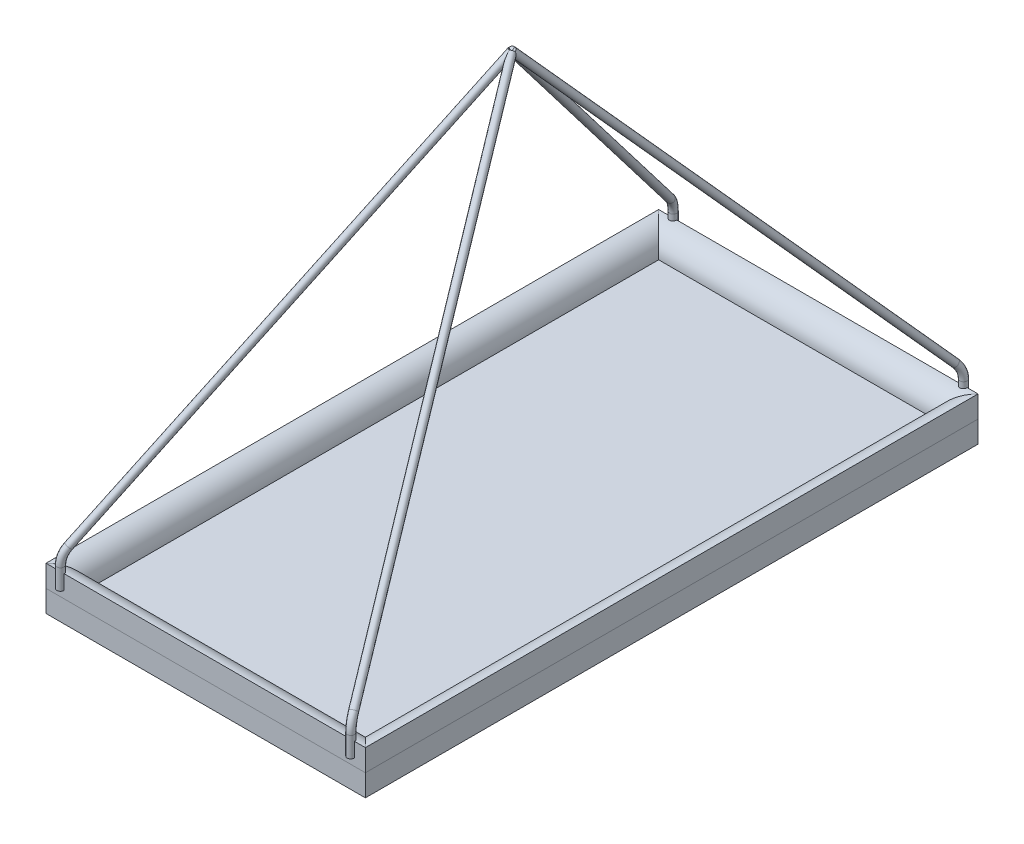
ISO-10303-21;
HEADER;
FILE_DESCRIPTION(('STEP AP214'),'2;1');
FILE_NAME('part.step','',(''),(''),'','','');
FILE_SCHEMA(('AUTOMOTIVE_DESIGN { 1 0 10303 214 1 1 1 1 }'));
ENDSEC;
DATA;
#1=APPLICATION_CONTEXT('core data for automotive mechanical design processes');
#2=APPLICATION_PROTOCOL_DEFINITION('international standard','automotive_design',2000,#1);
#3=PRODUCT_CONTEXT('',#1,'mechanical');
#4=PRODUCT('Part','Part','',(#3));
#5=PRODUCT_RELATED_PRODUCT_CATEGORY('part','',(#4));
#6=PRODUCT_DEFINITION_FORMATION('','',#4);
#7=PRODUCT_DEFINITION_CONTEXT('part definition',#1,'design');
#8=PRODUCT_DEFINITION('design','',#6,#7);
#9=PRODUCT_DEFINITION_SHAPE('','',#8);
#10=(LENGTH_UNIT() NAMED_UNIT(*) SI_UNIT(.MILLI.,.METRE.));
#11=(NAMED_UNIT(*) PLANE_ANGLE_UNIT() SI_UNIT($,.RADIAN.));
#12=(NAMED_UNIT(*) SI_UNIT($,.STERADIAN.) SOLID_ANGLE_UNIT());
#13=UNCERTAINTY_MEASURE_WITH_UNIT(LENGTH_MEASURE(1.E-05),#10,'distance_accuracy_value','');
#14=(GEOMETRIC_REPRESENTATION_CONTEXT(3) GLOBAL_UNCERTAINTY_ASSIGNED_CONTEXT((#13)) GLOBAL_UNIT_ASSIGNED_CONTEXT((#10,
#11,#12)) REPRESENTATION_CONTEXT('',''));
#15=CARTESIAN_POINT('',(0.,0.,0.));
#16=DIRECTION('',(0.,0.,1.));
#17=DIRECTION('',(1.,0.,0.));
#18=AXIS2_PLACEMENT_3D('',#15,#16,#17);
#19=CARTESIAN_POINT('',(110.,-0.01,211.01));
#20=DIRECTION('',(1.,0.,0.));
#21=DIRECTION('',(0.,0.,-1.));
#22=AXIS2_PLACEMENT_3D('',#19,#20,#21);
#23=PLANE('',#22);
#24=DIRECTION('',(0.,0.,-1.));
#25=VECTOR('',#24,1.);
#26=CARTESIAN_POINT('',(110.,15.,0.));
#27=LINE('',#26,#25);
#28=CARTESIAN_POINT('',(110.,15.,211.));
#29=VERTEX_POINT('',#28);
#30=CARTESIAN_POINT('',(110.,15.,-211.));
#31=VERTEX_POINT('',#30);
#32=EDGE_CURVE('P0_E69',#29,#31,#27,.T.);
#33=ORIENTED_EDGE('',*,*,#32,.F.);
#34=DIRECTION('',(0.,1.,0.));
#35=VECTOR('',#34,1.);
#36=CARTESIAN_POINT('',(110.,7.5,211.));
#37=LINE('',#36,#35);
#38=CARTESIAN_POINT('',(110.,0.,211.));
#39=VERTEX_POINT('',#38);
#40=EDGE_CURVE('P0_E56',#39,#29,#37,.T.);
#41=ORIENTED_EDGE('',*,*,#40,.F.);
#42=DIRECTION('',(0.,0.,1.));
#43=VECTOR('',#42,1.);
#44=CARTESIAN_POINT('',(110.,0.,0.));
#45=LINE('',#44,#43);
#46=CARTESIAN_POINT('',(110.,0.,-211.));
#47=VERTEX_POINT('',#46);
#48=EDGE_CURVE('P0_E21',#47,#39,#45,.T.);
#49=ORIENTED_EDGE('',*,*,#48,.F.);
#50=DIRECTION('',(0.,-1.,0.));
#51=VECTOR('',#50,1.);
#52=CARTESIAN_POINT('',(110.,7.5,-211.));
#53=LINE('',#52,#51);
#54=EDGE_CURVE('P0_E82',#31,#47,#53,.T.);
#55=ORIENTED_EDGE('',*,*,#54,.F.);
#56=EDGE_LOOP('',(#33,#41,#49,#55));
#57=FACE_BOUND('',#56,.T.);
#58=ADVANCED_FACE('P0_F17',(#57),#23,.T.);
#59=CARTESIAN_POINT('',(110.01,0.,211.01));
#60=DIRECTION('',(0.,-1.,0.));
#61=DIRECTION('',(-1.,0.,0.));
#62=AXIS2_PLACEMENT_3D('',#59,#60,#61);
#63=PLANE('',#62);
#64=DIRECTION('',(-1.,0.,0.));
#65=VECTOR('',#64,1.);
#66=CARTESIAN_POINT('',(0.,0.,-211.));
#67=LINE('',#66,#65);
#68=CARTESIAN_POINT('',(-110.,0.,-211.));
#69=VERTEX_POINT('',#68);
#70=EDGE_CURVE('P0_E65',#47,#69,#67,.T.);
#71=ORIENTED_EDGE('',*,*,#70,.F.);
#72=ORIENTED_EDGE('',*,*,#48,.T.);
#73=DIRECTION('',(1.,0.,0.));
#74=VECTOR('',#73,1.);
#75=CARTESIAN_POINT('',(0.,0.,211.));
#76=LINE('',#75,#74);
#77=CARTESIAN_POINT('',(-110.,0.,211.));
#78=VERTEX_POINT('',#77);
#79=EDGE_CURVE('P0_E62',#78,#39,#76,.T.);
#80=ORIENTED_EDGE('',*,*,#79,.F.);
#81=DIRECTION('',(0.,0.,1.));
#82=VECTOR('',#81,1.);
#83=CARTESIAN_POINT('',(-110.,0.,0.));
#84=LINE('',#83,#82);
#85=EDGE_CURVE('P0_E84',#69,#78,#84,.T.);
#86=ORIENTED_EDGE('',*,*,#85,.F.);
#87=EDGE_LOOP('',(#71,#72,#80,#86));
#88=FACE_BOUND('',#87,.T.);
#89=ADVANCED_FACE('P0_F61',(#88),#63,.T.);
#90=CARTESIAN_POINT('',(-110.01,-0.01,211.));
#91=DIRECTION('',(0.,0.,1.));
#92=DIRECTION('',(1.,0.,0.));
#93=AXIS2_PLACEMENT_3D('',#90,#91,#92);
#94=PLANE('',#93);
#95=DIRECTION('',(1.,0.,0.));
#96=VECTOR('',#95,1.);
#97=CARTESIAN_POINT('',(0.,15.,211.));
#98=LINE('',#97,#96);
#99=CARTESIAN_POINT('',(-110.,15.,211.));
#100=VERTEX_POINT('',#99);
#101=EDGE_CURVE('P0_E71',#100,#29,#98,.T.);
#102=ORIENTED_EDGE('',*,*,#101,.F.);
#103=DIRECTION('',(0.,1.,0.));
#104=VECTOR('',#103,1.);
#105=CARTESIAN_POINT('',(-110.,7.5,211.));
#106=LINE('',#105,#104);
#107=EDGE_CURVE('P0_E75',#78,#100,#106,.T.);
#108=ORIENTED_EDGE('',*,*,#107,.F.);
#109=ORIENTED_EDGE('',*,*,#79,.T.);
#110=ORIENTED_EDGE('',*,*,#40,.T.);
#111=EDGE_LOOP('',(#102,#108,#109,#110));
#112=FACE_BOUND('',#111,.T.);
#113=ADVANCED_FACE('P0_F73',(#112),#94,.T.);
#114=CARTESIAN_POINT('',(-110.01,15.,-211.01));
#115=DIRECTION('',(0.,1.,0.));
#116=DIRECTION('',(0.,0.,1.));
#117=AXIS2_PLACEMENT_3D('',#114,#115,#116);
#118=PLANE('',#117);
#119=DIRECTION('',(1.,0.,0.));
#120=VECTOR('',#119,1.);
#121=CARTESIAN_POINT('',(0.,15.,-211.));
#122=LINE('',#121,#120);
#123=CARTESIAN_POINT('',(-110.,15.,-211.));
#124=VERTEX_POINT('',#123);
#125=EDGE_CURVE('P0_E36',#124,#31,#122,.T.);
#126=ORIENTED_EDGE('',*,*,#125,.F.);
#127=DIRECTION('',(0.,0.,-1.));
#128=VECTOR('',#127,1.);
#129=CARTESIAN_POINT('',(-110.,15.,0.));
#130=LINE('',#129,#128);
#131=EDGE_CURVE('P0_E27',#100,#124,#130,.T.);
#132=ORIENTED_EDGE('',*,*,#131,.F.);
#133=ORIENTED_EDGE('',*,*,#101,.T.);
#134=ORIENTED_EDGE('',*,*,#32,.T.);
#135=EDGE_LOOP('',(#126,#132,#133,#134));
#136=FACE_BOUND('',#135,.T.);
#137=ADVANCED_FACE('P0_F89',(#136),#118,.T.);
#138=CARTESIAN_POINT('',(110.01,-0.01,-211.));
#139=DIRECTION('',(0.,0.,-1.));
#140=DIRECTION('',(-1.,0.,0.));
#141=AXIS2_PLACEMENT_3D('',#138,#139,#140);
#142=PLANE('',#141);
#143=ORIENTED_EDGE('',*,*,#125,.T.);
#144=ORIENTED_EDGE('',*,*,#54,.T.);
#145=ORIENTED_EDGE('',*,*,#70,.T.);
#146=DIRECTION('',(0.,-1.,0.));
#147=VECTOR('',#146,1.);
#148=CARTESIAN_POINT('',(-110.,7.5,-211.));
#149=LINE('',#148,#147);
#150=EDGE_CURVE('P0_E11',#124,#69,#149,.T.);
#151=ORIENTED_EDGE('',*,*,#150,.F.);
#152=EDGE_LOOP('',(#143,#144,#145,#151));
#153=FACE_BOUND('',#152,.T.);
#154=ADVANCED_FACE('P0_F91',(#153),#142,.T.);
#155=CARTESIAN_POINT('',(-110.,-0.01,-211.01));
#156=DIRECTION('',(-1.,0.,0.));
#157=DIRECTION('',(0.,0.,1.));
#158=AXIS2_PLACEMENT_3D('',#155,#156,#157);
#159=PLANE('',#158);
#160=ORIENTED_EDGE('',*,*,#131,.T.);
#161=ORIENTED_EDGE('',*,*,#150,.T.);
#162=ORIENTED_EDGE('',*,*,#85,.T.);
#163=ORIENTED_EDGE('',*,*,#107,.T.);
#164=EDGE_LOOP('',(#160,#161,#162,#163));
#165=FACE_BOUND('',#164,.T.);
#166=ADVANCED_FACE('P0_F19',(#165),#159,.T.);
#167=CLOSED_SHELL('',(#58,#89,#113,#137,#154,#166));
#168=MANIFOLD_SOLID_BREP('P0_B1',#167);
#169=CARTESIAN_POINT('',(98.74,18.7399999999999,206.));
#170=DIRECTION('',(0.,0.,1.));
#171=DIRECTION('',(1.,0.,0.));
#172=AXIS2_PLACEMENT_3D('',#169,#170,#171);
#173=PLANE('',#172);
#174=CARTESIAN_POINT('',(100.,19.9999999999999,206.));
#175=DIRECTION('',(0.,0.,-1.));
#176=DIRECTION('',(-1.,0.,0.));
#177=AXIS2_PLACEMENT_3D('',#174,#175,#176);
#178=CIRCLE('',#177,1.24999999999999);
#179=CARTESIAN_POINT('',(98.75,19.9999999999999,206.));
#180=VERTEX_POINT('',#179);
#181=EDGE_CURVE('P1_E21',#180,#180,#178,.T.);
#182=ORIENTED_EDGE('',*,*,#181,.F.);
#183=EDGE_LOOP('',(#182));
#184=FACE_BOUND('',#183,.T.);
#185=ADVANCED_FACE('P1_F17',(#184),#173,.T.);
#186=CARTESIAN_POINT('',(-101.26,18.7399999999999,206.));
#187=DIRECTION('',(0.,0.,1.));
#188=DIRECTION('',(1.,0.,0.));
#189=AXIS2_PLACEMENT_3D('',#186,#187,#188);
#190=PLANE('',#189);
#191=CARTESIAN_POINT('',(-100.,19.9999999999999,206.));
#192=DIRECTION('',(0.,0.,-1.));
#193=DIRECTION('',(-1.,0.,0.));
#194=AXIS2_PLACEMENT_3D('',#191,#192,#193);
#195=CIRCLE('',#194,1.25);
#196=CARTESIAN_POINT('',(-101.25,19.9999999999999,206.));
#197=VERTEX_POINT('',#196);
#198=EDGE_CURVE('P1_E116',#197,#197,#195,.T.);
#199=ORIENTED_EDGE('',*,*,#198,.F.);
#200=EDGE_LOOP('',(#199));
#201=FACE_BOUND('',#200,.T.);
#202=ADVANCED_FACE('P1_F128',(#201),#190,.T.);
#203=CARTESIAN_POINT('',(100.,19.9999999999999,211.));
#204=DIRECTION('',(0.,0.,-1.));
#205=DIRECTION('',(-1.,0.,0.));
#206=AXIS2_PLACEMENT_3D('',#203,#204,#205);
#207=CYLINDRICAL_SURFACE('',#206,1.24999999999999);
#208=ORIENTED_EDGE('',*,*,#181,.T.);
#209=EDGE_LOOP('',(#208));
#210=FACE_BOUND('',#209,.T.);
#211=CARTESIAN_POINT('',(100.,19.9999999999999,211.));
#212=DIRECTION('',(0.,0.,-1.));
#213=DIRECTION('',(-1.,0.,0.));
#214=AXIS2_PLACEMENT_3D('',#211,#212,#213);
#215=CIRCLE('',#214,1.24999999999999);
#216=CARTESIAN_POINT('',(98.75,19.9999999999999,211.));
#217=VERTEX_POINT('',#216);
#218=EDGE_CURVE('P1_E114',#217,#217,#215,.T.);
#219=ORIENTED_EDGE('',*,*,#218,.F.);
#220=EDGE_LOOP('',(#219));
#221=FACE_BOUND('',#220,.T.);
#222=ADVANCED_FACE('P1_F124',(#210,#221),#207,.F.);
#223=CARTESIAN_POINT('',(-100.,19.9999999999999,211.));
#224=DIRECTION('',(0.,0.,-1.));
#225=DIRECTION('',(-1.,0.,0.));
#226=AXIS2_PLACEMENT_3D('',#223,#224,#225);
#227=CYLINDRICAL_SURFACE('',#226,1.25);
#228=ORIENTED_EDGE('',*,*,#198,.T.);
#229=EDGE_LOOP('',(#228));
#230=FACE_BOUND('',#229,.T.);
#231=CARTESIAN_POINT('',(-100.,19.9999999999999,211.));
#232=DIRECTION('',(0.,0.,-1.));
#233=DIRECTION('',(-1.,0.,0.));
#234=AXIS2_PLACEMENT_3D('',#231,#232,#233);
#235=CIRCLE('',#234,1.25);
#236=CARTESIAN_POINT('',(-101.25,19.9999999999999,211.));
#237=VERTEX_POINT('',#236);
#238=EDGE_CURVE('P1_E81',#237,#237,#235,.T.);
#239=ORIENTED_EDGE('',*,*,#238,.F.);
#240=EDGE_LOOP('',(#239));
#241=FACE_BOUND('',#240,.T.);
#242=ADVANCED_FACE('P1_F302',(#230,#241),#227,.F.);
#243=CARTESIAN_POINT('',(110.,15.0000000000001,211.));
#244=DIRECTION('',(-1.,0.,0.));
#245=DIRECTION('',(0.,0.,1.));
#246=AXIS2_PLACEMENT_3D('',#243,#244,#245);
#247=CYLINDRICAL_SURFACE('',#246,14.9999999999999);
#248=CARTESIAN_POINT('',(110.,15.0000000000001,211.));
#249=DIRECTION('',(-0.707106781186547,0.,0.707106781186547));
#250=DIRECTION('',(-0.707106781186547,0.,-0.707106781186547));
#251=AXIS2_PLACEMENT_3D('',#248,#249,#250);
#252=ELLIPSE('',#251,21.2132034355963,14.9999999999999);
#253=CARTESIAN_POINT('',(95.0000000000001,15.,196.));
#254=VERTEX_POINT('',#253);
#255=CARTESIAN_POINT('',(110.,29.999999999999,211.));
#256=VERTEX_POINT('',#255);
#257=EDGE_CURVE('P1_E69',#254,#256,#252,.F.);
#258=ORIENTED_EDGE('',*,*,#257,.F.);
#259=DIRECTION('',(1.,0.,0.));
#260=VECTOR('',#259,1.);
#261=CARTESIAN_POINT('',(-95.,15.,196.));
#262=LINE('',#261,#260);
#263=CARTESIAN_POINT('',(-95.,15.,196.));
#264=VERTEX_POINT('',#263);
#265=EDGE_CURVE('P1_E73',#264,#254,#262,.T.);
#266=ORIENTED_EDGE('',*,*,#265,.F.);
#267=CARTESIAN_POINT('',(-110.,15.0000000000001,211.));
#268=DIRECTION('',(-0.707106781186547,0.,-0.707106781186547));
#269=DIRECTION('',(-0.707106781186547,0.,0.707106781186547));
#270=AXIS2_PLACEMENT_3D('',#267,#268,#269);
#271=ELLIPSE('',#270,21.2132034355963,14.9999999999999);
#272=CARTESIAN_POINT('',(-110.,30.,211.));
#273=VERTEX_POINT('',#272);
#274=EDGE_CURVE('P1_E80',#273,#264,#271,.T.);
#275=ORIENTED_EDGE('',*,*,#274,.F.);
#276=DIRECTION('',(-1.,0.,0.));
#277=VECTOR('',#276,1.);
#278=CARTESIAN_POINT('',(0.,30.,211.));
#279=LINE('',#278,#277);
#280=EDGE_CURVE('P1_E76',#256,#273,#279,.T.);
#281=ORIENTED_EDGE('',*,*,#280,.F.);
#282=EDGE_LOOP('',(#258,#266,#275,#281));
#283=FACE_BOUND('',#282,.T.);
#284=ADVANCED_FACE('P1_F71',(#283),#247,.T.);
#285=CARTESIAN_POINT('',(-110.01,30.01,211.));
#286=DIRECTION('',(0.,0.,1.));
#287=DIRECTION('',(0.,-1.,0.));
#288=AXIS2_PLACEMENT_3D('',#285,#286,#287);
#289=PLANE('',#288);
#290=ORIENTED_EDGE('',*,*,#238,.T.);
#291=EDGE_LOOP('',(#290));
#292=FACE_BOUND('',#291,.T.);
#293=ORIENTED_EDGE('',*,*,#218,.T.);
#294=EDGE_LOOP('',(#293));
#295=FACE_BOUND('',#294,.T.);
#296=DIRECTION('',(0.,-1.,0.));
#297=VECTOR('',#296,1.);
#298=CARTESIAN_POINT('',(110.,22.499999999999,211.));
#299=LINE('',#298,#297);
#300=CARTESIAN_POINT('',(110.,15.,211.));
#301=VERTEX_POINT('',#300);
#302=EDGE_CURVE('P1_E110',#256,#301,#299,.T.);
#303=ORIENTED_EDGE('',*,*,#302,.F.);
#304=ORIENTED_EDGE('',*,*,#280,.T.);
#305=DIRECTION('',(0.,1.,0.));
#306=VECTOR('',#305,1.);
#307=CARTESIAN_POINT('',(-110.,22.500000000001,211.));
#308=LINE('',#307,#306);
#309=CARTESIAN_POINT('',(-110.,15.000000000001,211.));
#310=VERTEX_POINT('',#309);
#311=EDGE_CURVE('P1_E99',#310,#273,#308,.T.);
#312=ORIENTED_EDGE('',*,*,#311,.F.);
#313=DIRECTION('',(-1.,0.,0.));
#314=VECTOR('',#313,1.);
#315=CARTESIAN_POINT('',(110.,15.,211.));
#316=LINE('',#315,#314);
#317=EDGE_CURVE('P1_E107',#301,#310,#316,.T.);
#318=ORIENTED_EDGE('',*,*,#317,.F.);
#319=EDGE_LOOP('',(#303,#304,#312,#318));
#320=FACE_BOUND('',#319,.T.);
#321=ADVANCED_FACE('P1_F286',(#292,#295,#320),#289,.T.);
#322=CARTESIAN_POINT('',(110.,15.,-211.));
#323=DIRECTION('',(0.,0.,1.));
#324=DIRECTION('',(1.,0.,0.));
#325=AXIS2_PLACEMENT_3D('',#322,#323,#324);
#326=CYLINDRICAL_SURFACE('',#325,14.9999999999999);
#327=CARTESIAN_POINT('',(110.,15.0000000000001,-211.));
#328=DIRECTION('',(0.707106781186547,0.,0.707106781186547));
#329=DIRECTION('',(-0.707106781186547,0.,0.707106781186547));
#330=AXIS2_PLACEMENT_3D('',#327,#328,#329);
#331=ELLIPSE('',#330,21.2132034355963,14.9999999999999);
#332=CARTESIAN_POINT('',(94.9999999999999,15.,-196.));
#333=VERTEX_POINT('',#332);
#334=CARTESIAN_POINT('',(110.,29.9999999999995,-211.));
#335=VERTEX_POINT('',#334);
#336=EDGE_CURVE('P1_E87',#333,#335,#331,.F.);
#337=ORIENTED_EDGE('',*,*,#336,.F.);
#338=DIRECTION('',(0.,0.,-1.));
#339=VECTOR('',#338,1.);
#340=CARTESIAN_POINT('',(95.0000000000001,15.,196.));
#341=LINE('',#340,#339);
#342=EDGE_CURVE('P1_E84',#254,#333,#341,.T.);
#343=ORIENTED_EDGE('',*,*,#342,.F.);
#344=ORIENTED_EDGE('',*,*,#257,.T.);
#345=DIRECTION('',(0.,0.,1.));
#346=VECTOR('',#345,1.);
#347=CARTESIAN_POINT('',(110.,29.999999999999,0.));
#348=LINE('',#347,#346);
#349=EDGE_CURVE('P1_E109',#335,#256,#348,.T.);
#350=ORIENTED_EDGE('',*,*,#349,.F.);
#351=EDGE_LOOP('',(#337,#343,#344,#350));
#352=FACE_BOUND('',#351,.T.);
#353=ADVANCED_FACE('P1_F85',(#352),#326,.T.);
#354=CARTESIAN_POINT('',(-110.,15.,211.));
#355=DIRECTION('',(0.,0.,-1.));
#356=DIRECTION('',(-1.,0.,0.));
#357=AXIS2_PLACEMENT_3D('',#354,#355,#356);
#358=CYLINDRICAL_SURFACE('',#357,14.9999999999999);
#359=ORIENTED_EDGE('',*,*,#274,.T.);
#360=DIRECTION('',(0.,0.,1.));
#361=VECTOR('',#360,1.);
#362=CARTESIAN_POINT('',(-95.,15.,-196.));
#363=LINE('',#362,#361);
#364=CARTESIAN_POINT('',(-95.,15.,-196.));
#365=VERTEX_POINT('',#364);
#366=EDGE_CURVE('P1_E91',#365,#264,#363,.T.);
#367=ORIENTED_EDGE('',*,*,#366,.F.);
#368=CARTESIAN_POINT('',(-110.,15.0000000000001,-211.));
#369=DIRECTION('',(0.707106781186547,0.,-0.707106781186547));
#370=DIRECTION('',(-0.707106781186547,0.,-0.707106781186547));
#371=AXIS2_PLACEMENT_3D('',#368,#369,#370);
#372=ELLIPSE('',#371,21.2132034355963,14.9999999999999);
#373=CARTESIAN_POINT('',(-110.,29.999999999999,-211.));
#374=VERTEX_POINT('',#373);
#375=EDGE_CURVE('P1_E36',#374,#365,#372,.T.);
#376=ORIENTED_EDGE('',*,*,#375,.F.);
#377=DIRECTION('',(0.,0.,-1.));
#378=VECTOR('',#377,1.);
#379=CARTESIAN_POINT('',(-110.,29.999999999999,0.));
#380=LINE('',#379,#378);
#381=EDGE_CURVE('P1_E163',#273,#374,#380,.T.);
#382=ORIENTED_EDGE('',*,*,#381,.F.);
#383=EDGE_LOOP('',(#359,#367,#376,#382));
#384=FACE_BOUND('',#383,.T.);
#385=ADVANCED_FACE('P1_F270',(#384),#358,.T.);
#386=CARTESIAN_POINT('',(101.26,18.7399999999999,-206.));
#387=DIRECTION('',(0.,0.,-1.));
#388=DIRECTION('',(-1.,0.,0.));
#389=AXIS2_PLACEMENT_3D('',#386,#387,#388);
#390=PLANE('',#389);
#391=CARTESIAN_POINT('',(100.,19.9999999999999,-206.));
#392=DIRECTION('',(0.,0.,-1.));
#393=DIRECTION('',(-1.,0.,0.));
#394=AXIS2_PLACEMENT_3D('',#391,#392,#393);
#395=CIRCLE('',#394,1.24999999999999);
#396=CARTESIAN_POINT('',(98.75,19.9999999999999,-206.));
#397=VERTEX_POINT('',#396);
#398=EDGE_CURVE('P1_E156',#397,#397,#395,.F.);
#399=ORIENTED_EDGE('',*,*,#398,.F.);
#400=EDGE_LOOP('',(#399));
#401=FACE_BOUND('',#400,.T.);
#402=ADVANCED_FACE('P1_F262',(#401),#390,.T.);
#403=CARTESIAN_POINT('',(110.,30.01,211.01));
#404=DIRECTION('',(1.,0.,0.));
#405=DIRECTION('',(0.,-1.,0.));
#406=AXIS2_PLACEMENT_3D('',#403,#404,#405);
#407=PLANE('',#406);
#408=DIRECTION('',(0.,-1.,0.));
#409=VECTOR('',#408,1.);
#410=CARTESIAN_POINT('',(110.,22.4999999999995,-211.));
#411=LINE('',#410,#409);
#412=CARTESIAN_POINT('',(110.,15.,-211.));
#413=VERTEX_POINT('',#412);
#414=EDGE_CURVE('P1_E158',#335,#413,#411,.T.);
#415=ORIENTED_EDGE('',*,*,#414,.F.);
#416=ORIENTED_EDGE('',*,*,#349,.T.);
#417=ORIENTED_EDGE('',*,*,#302,.T.);
#418=DIRECTION('',(0.,0.,1.));
#419=VECTOR('',#418,1.);
#420=CARTESIAN_POINT('',(110.,15.,-211.));
#421=LINE('',#420,#419);
#422=EDGE_CURVE('P1_E92',#413,#301,#421,.T.);
#423=ORIENTED_EDGE('',*,*,#422,.F.);
#424=EDGE_LOOP('',(#415,#416,#417,#423));
#425=FACE_BOUND('',#424,.T.);
#426=ADVANCED_FACE('P1_F184',(#425),#407,.T.);
#427=CARTESIAN_POINT('',(0.,15.,321.014142135624));
#428=DIRECTION('',(0.,-1.,0.));
#429=DIRECTION('',(-0.707106781186548,0.,-0.707106781186547));
#430=AXIS2_PLACEMENT_3D('',#427,#428,#429);
#431=PLANE('',#430);
#432=ORIENTED_EDGE('',*,*,#366,.T.);
#433=ORIENTED_EDGE('',*,*,#265,.T.);
#434=ORIENTED_EDGE('',*,*,#342,.T.);
#435=DIRECTION('',(1.,0.,0.));
#436=VECTOR('',#435,1.);
#437=CARTESIAN_POINT('',(0.,15.0000000000001,-196.));
#438=LINE('',#437,#436);
#439=EDGE_CURVE('P1_E159',#365,#333,#438,.T.);
#440=ORIENTED_EDGE('',*,*,#439,.F.);
#441=EDGE_LOOP('',(#432,#433,#434,#440));
#442=FACE_BOUND('',#441,.T.);
#443=DIRECTION('',(-1.,0.,0.));
#444=VECTOR('',#443,1.);
#445=CARTESIAN_POINT('',(0.,15.0000000000005,-211.));
#446=LINE('',#445,#444);
#447=CARTESIAN_POINT('',(-110.,15.0000000000007,-211.));
#448=VERTEX_POINT('',#447);
#449=EDGE_CURVE('P1_E175',#413,#448,#446,.T.);
#450=ORIENTED_EDGE('',*,*,#449,.F.);
#451=ORIENTED_EDGE('',*,*,#422,.T.);
#452=ORIENTED_EDGE('',*,*,#317,.T.);
#453=DIRECTION('',(0.,0.,1.));
#454=VECTOR('',#453,1.);
#455=CARTESIAN_POINT('',(-110.,15.000000000001,0.));
#456=LINE('',#455,#454);
#457=EDGE_CURVE('P1_E96',#448,#310,#456,.T.);
#458=ORIENTED_EDGE('',*,*,#457,.F.);
#459=EDGE_LOOP('',(#450,#451,#452,#458));
#460=FACE_BOUND('',#459,.T.);
#461=ADVANCED_FACE('P1_F94',(#442,#460),#431,.T.);
#462=CARTESIAN_POINT('',(-110.,30.01,-211.01));
#463=DIRECTION('',(-1.,0.,0.));
#464=DIRECTION('',(0.,-1.,0.));
#465=AXIS2_PLACEMENT_3D('',#462,#463,#464);
#466=PLANE('',#465);
#467=ORIENTED_EDGE('',*,*,#311,.T.);
#468=ORIENTED_EDGE('',*,*,#381,.T.);
#469=DIRECTION('',(0.,1.,0.));
#470=VECTOR('',#469,1.);
#471=CARTESIAN_POINT('',(-110.,22.5000000000005,-211.));
#472=LINE('',#471,#470);
#473=EDGE_CURVE('P1_E178',#448,#374,#472,.T.);
#474=ORIENTED_EDGE('',*,*,#473,.F.);
#475=ORIENTED_EDGE('',*,*,#457,.T.);
#476=EDGE_LOOP('',(#467,#468,#474,#475));
#477=FACE_BOUND('',#476,.T.);
#478=ADVANCED_FACE('P1_F197',(#477),#466,.T.);
#479=CARTESIAN_POINT('',(-110.,15.0000000000001,-211.));
#480=DIRECTION('',(1.,0.,0.));
#481=DIRECTION('',(0.,0.,-1.));
#482=AXIS2_PLACEMENT_3D('',#479,#480,#481);
#483=CYLINDRICAL_SURFACE('',#482,14.9999999999999);
#484=ORIENTED_EDGE('',*,*,#375,.T.);
#485=ORIENTED_EDGE('',*,*,#439,.T.);
#486=ORIENTED_EDGE('',*,*,#336,.T.);
#487=DIRECTION('',(1.,0.,0.));
#488=VECTOR('',#487,1.);
#489=CARTESIAN_POINT('',(0.,29.9999999999995,-211.));
#490=LINE('',#489,#488);
#491=EDGE_CURVE('P1_E152',#374,#335,#490,.T.);
#492=ORIENTED_EDGE('',*,*,#491,.F.);
#493=EDGE_LOOP('',(#484,#485,#486,#492));
#494=FACE_BOUND('',#493,.T.);
#495=ADVANCED_FACE('P1_F194',(#494),#483,.T.);
#496=CARTESIAN_POINT('',(100.,19.9999999999999,-206.));
#497=DIRECTION('',(0.,0.,-1.));
#498=DIRECTION('',(-1.,0.,0.));
#499=AXIS2_PLACEMENT_3D('',#496,#497,#498);
#500=CYLINDRICAL_SURFACE('',#499,1.24999999999999);
#501=ORIENTED_EDGE('',*,*,#398,.T.);
#502=EDGE_LOOP('',(#501));
#503=FACE_BOUND('',#502,.T.);
#504=CARTESIAN_POINT('',(100.,19.9999999999999,-211.));
#505=DIRECTION('',(0.,0.,-1.));
#506=DIRECTION('',(-1.,0.,0.));
#507=AXIS2_PLACEMENT_3D('',#504,#505,#506);
#508=CIRCLE('',#507,1.24999999999999);
#509=CARTESIAN_POINT('',(98.75,19.9999999999999,-211.));
#510=VERTEX_POINT('',#509);
#511=EDGE_CURVE('P1_E149',#510,#510,#508,.F.);
#512=ORIENTED_EDGE('',*,*,#511,.F.);
#513=EDGE_LOOP('',(#512));
#514=FACE_BOUND('',#513,.T.);
#515=ADVANCED_FACE('P1_F196',(#503,#514),#500,.F.);
#516=CARTESIAN_POINT('',(110.01,30.01,-211.));
#517=DIRECTION('',(0.,0.,-1.));
#518=DIRECTION('',(0.,-1.,0.));
#519=AXIS2_PLACEMENT_3D('',#516,#517,#518);
#520=PLANE('',#519);
#521=CARTESIAN_POINT('',(-100.,19.9999999999999,-211.));
#522=DIRECTION('',(0.,0.,-1.));
#523=DIRECTION('',(-1.,0.,0.));
#524=AXIS2_PLACEMENT_3D('',#521,#522,#523);
#525=CIRCLE('',#524,1.25);
#526=CARTESIAN_POINT('',(-101.25,19.9999999999999,-211.));
#527=VERTEX_POINT('',#526);
#528=EDGE_CURVE('P1_E27',#527,#527,#525,.T.);
#529=ORIENTED_EDGE('',*,*,#528,.F.);
#530=EDGE_LOOP('',(#529));
#531=FACE_BOUND('',#530,.T.);
#532=ORIENTED_EDGE('',*,*,#511,.T.);
#533=EDGE_LOOP('',(#532));
#534=FACE_BOUND('',#533,.T.);
#535=ORIENTED_EDGE('',*,*,#473,.T.);
#536=ORIENTED_EDGE('',*,*,#491,.T.);
#537=ORIENTED_EDGE('',*,*,#414,.T.);
#538=ORIENTED_EDGE('',*,*,#449,.T.);
#539=EDGE_LOOP('',(#535,#536,#537,#538));
#540=FACE_BOUND('',#539,.T.);
#541=ADVANCED_FACE('P1_F142',(#531,#534,#540),#520,.T.);
#542=CARTESIAN_POINT('',(-98.74,18.7399999999999,-206.));
#543=DIRECTION('',(0.,0.,-1.));
#544=DIRECTION('',(-1.,0.,0.));
#545=AXIS2_PLACEMENT_3D('',#542,#543,#544);
#546=PLANE('',#545);
#547=CARTESIAN_POINT('',(-100.,19.9999999999999,-206.));
#548=DIRECTION('',(0.,0.,-1.));
#549=DIRECTION('',(-1.,0.,0.));
#550=AXIS2_PLACEMENT_3D('',#547,#548,#549);
#551=CIRCLE('',#550,1.25);
#552=CARTESIAN_POINT('',(-101.25,19.9999999999999,-206.));
#553=VERTEX_POINT('',#552);
#554=EDGE_CURVE('P1_E11',#553,#553,#551,.F.);
#555=ORIENTED_EDGE('',*,*,#554,.F.);
#556=EDGE_LOOP('',(#555));
#557=FACE_BOUND('',#556,.T.);
#558=ADVANCED_FACE('P1_F137',(#557),#546,.T.);
#559=CARTESIAN_POINT('',(-100.,19.9999999999999,-206.));
#560=DIRECTION('',(0.,0.,-1.));
#561=DIRECTION('',(-1.,0.,0.));
#562=AXIS2_PLACEMENT_3D('',#559,#560,#561);
#563=CYLINDRICAL_SURFACE('',#562,1.25);
#564=ORIENTED_EDGE('',*,*,#554,.T.);
#565=EDGE_LOOP('',(#564));
#566=FACE_BOUND('',#565,.T.);
#567=ORIENTED_EDGE('',*,*,#528,.T.);
#568=EDGE_LOOP('',(#567));
#569=FACE_BOUND('',#568,.T.);
#570=ADVANCED_FACE('P1_F19',(#566,#569),#563,.F.);
#571=CLOSED_SHELL('',(#185,#202,#222,#242,#284,#321,#353,#385,#402,#426,#461,#478,#495,#515,
#541,#558,#570));
#572=MANIFOLD_SOLID_BREP('P1_B1',#571);
#573=CARTESIAN_POINT('',(1.73253432181211,282.602687539996,-1.96250294085171));
#574=DIRECTION('',(0.295467716648814,0.723895905789918,-0.623436882129161));
#575=DIRECTION('',(-0.925847643695258,0.377896997426467,0.));
#576=AXIS2_PLACEMENT_3D('',#573,#574,#575);
#577=PLANE('',#576);
#578=CARTESIAN_POINT('',(-1.0695478341368E-13,285.,-2.93424059948371E-13));
#579=DIRECTION('',(-0.295467716649031,-0.723895905789801,0.623436882129195));
#580=DIRECTION('',(0.,-0.652572464671857,-0.757726321538389));
#581=AXIS2_PLACEMENT_3D('',#578,#579,#580);
#582=CIRCLE('',#581,2.49999999999986);
#583=CARTESIAN_POINT('',(-1.0695478341368E-13,283.36856883832,-1.89431580384616));
#584=VERTEX_POINT('',#583);
#585=EDGE_CURVE('P2_E19',#584,#584,#582,.T.);
#586=ORIENTED_EDGE('',*,*,#585,.F.);
#587=EDGE_LOOP('',(#586));
#588=FACE_BOUND('',#587,.T.);
#589=ADVANCED_FACE('P2_F15',(#588),#577,.T.);
#590=CARTESIAN_POINT('',(-1.7650811368064E-13,285.,-1.46666533085148E-13));
#591=DIRECTION('',(-0.295467716649031,-0.723895905789801,0.623436882129195));
#592=DIRECTION('',(0.,-0.652572464671857,-0.757726321538389));
#593=AXIS2_PLACEMENT_3D('',#590,#591,#592);
#594=CYLINDRICAL_SURFACE('',#593,2.49999999999986);
#595=CARTESIAN_POINT('',(-98.2262916961208,44.3455853445022,207.257475478816));
#596=DIRECTION('',(-0.295467716648877,-0.723895905789754,0.623436882129322));
#597=DIRECTION('',(0.,-0.652572464671958,-0.757726321538302));
#598=AXIS2_PLACEMENT_3D('',#595,#596,#597);
#599=CIRCLE('',#598,2.49999999999934);
#600=CARTESIAN_POINT('',(-99.0013497304924,46.0703583686645,208.89284793134));
#601=VERTEX_POINT('',#600);
#602=EDGE_CURVE('P2_E28',#601,#601,#599,.T.);
#603=ORIENTED_EDGE('',*,*,#602,.F.);
#604=EDGE_LOOP('',(#603));
#605=FACE_BOUND('',#604,.T.);
#606=ORIENTED_EDGE('',*,*,#585,.T.);
#607=EDGE_LOOP('',(#606));
#608=FACE_BOUND('',#607,.T.);
#609=ADVANCED_FACE('P2_F36',(#605,#608),#594,.T.);
#610=CARTESIAN_POINT('',(-102.829476985244,19.9999999999997,208.85657750549));
#611=DIRECTION('',(0.,-1.,0.));
#612=DIRECTION('',(0.990617426245936,0.,-0.136664241182093));
#613=AXIS2_PLACEMENT_3D('',#610,#611,#612);
#614=PLANE('',#613);
#615=CARTESIAN_POINT('',(-99.9999999999998,19.9999999999997,211.));
#616=DIRECTION('',(0.,1.,0.));
#617=DIRECTION('',(0.,0.,1.));
#618=AXIS2_PLACEMENT_3D('',#615,#616,#617);
#619=CIRCLE('',#618,2.49999999999996);
#620=CARTESIAN_POINT('',(-99.9999999999998,19.9999999999997,213.5));
#621=VERTEX_POINT('',#620);
#622=EDGE_CURVE('P2_E23',#621,#621,#619,.T.);
#623=ORIENTED_EDGE('',*,*,#622,.F.);
#624=EDGE_LOOP('',(#623));
#625=FACE_BOUND('',#624,.T.);
#626=ADVANCED_FACE('P2_F44',(#625),#614,.T.);
#627=CARTESIAN_POINT('',(-93.5759434898902,33.9969471995263,197.445240763669));
#628=DIRECTION('',(0.903650615755443,0.,0.428270434007308));
#629=DIRECTION('',(0.428270434007308,0.,-0.903650615755443));
#630=AXIS2_PLACEMENT_3D('',#627,#628,#629);
#631=TOROIDAL_SURFACE('',#630,14.9999999999992,2.49999999999934);
#632=CARTESIAN_POINT('',(-99.9999999999998,33.996947199526,211.));
#633=DIRECTION('',(0.,-1.,0.));
#634=DIRECTION('',(0.,0.,-1.));
#635=AXIS2_PLACEMENT_3D('',#632,#633,#634);
#636=CIRCLE('',#635,2.49999999999986);
#637=CARTESIAN_POINT('',(-101.070676085018,33.9969471995259,213.259126539388));
#638=VERTEX_POINT('',#637);
#639=EDGE_CURVE('P2_E10',#638,#638,#636,.T.);
#640=CARTESIAN_POINT('',(-93.5759434898902,33.9969471995263,197.445240763669));
#641=DIRECTION('',(0.903650615755443,0.,0.428270434007308));
#642=DIRECTION('',(0.428270434007308,0.,-0.903650615755443));
#643=AXIS2_PLACEMENT_3D('',#640,#641,#642);
#644=CIRCLE('',#643,17.4999999999986);
#645=EDGE_CURVE('',#601,#638,#644,.T.);
#646=ORIENTED_EDGE('',*,*,#602,.T.);
#647=ORIENTED_EDGE('',*,*,#639,.F.);
#648=ORIENTED_EDGE('',*,*,#645,.T.);
#649=ORIENTED_EDGE('',*,*,#645,.F.);
#650=EDGE_LOOP('',(#646,#648,#647,#649));
#651=FACE_BOUND('',#650,.T.);
#652=ADVANCED_FACE('P2_F48',(#651),#631,.T.);
#653=CARTESIAN_POINT('',(-99.9999999999998,19.9999999999996,211.));
#654=DIRECTION('',(0.,1.,0.));
#655=DIRECTION('',(0.,0.,1.));
#656=AXIS2_PLACEMENT_3D('',#653,#654,#655);
#657=CYLINDRICAL_SURFACE('',#656,2.49999999999996);
#658=ORIENTED_EDGE('',*,*,#639,.T.);
#659=EDGE_LOOP('',(#658));
#660=FACE_BOUND('',#659,.T.);
#661=ORIENTED_EDGE('',*,*,#622,.T.);
#662=EDGE_LOOP('',(#661));
#663=FACE_BOUND('',#662,.T.);
#664=ADVANCED_FACE('P2_F17',(#660,#663),#657,.T.);
#665=CLOSED_SHELL('',(#589,#609,#626,#652,#664));
#666=MANIFOLD_SOLID_BREP('P2_B1',#665);
#667=CARTESIAN_POINT('',(2.91522084953783,284.499730467077,-1.96250294085171));
#668=DIRECTION('',(-0.295467716648776,0.723895905789826,-0.623436882129287));
#669=DIRECTION('',(-0.925847643695258,-0.377896997426467,0.));
#670=AXIS2_PLACEMENT_3D('',#667,#668,#669);
#671=PLANE('',#670);
#672=CARTESIAN_POINT('',(7.38298311375729E-12,284.999999999964,-4.5546899585247E-11));
#673=DIRECTION('',(-0.295467716648893,0.723895905789732,-0.623436882129341));
#674=DIRECTION('',(0.,0.652572464671981,0.757726321538282));
#675=AXIS2_PLACEMENT_3D('',#672,#673,#674);
#676=CIRCLE('',#675,2.49999999999973);
#677=CARTESIAN_POINT('',(7.38298311375729E-12,286.631431161644,1.89431580379996));
#678=VERTEX_POINT('',#677);
#679=EDGE_CURVE('P3_E19',#678,#678,#676,.F.);
#680=ORIENTED_EDGE('',*,*,#679,.F.);
#681=EDGE_LOOP('',(#680));
#682=FACE_BOUND('',#681,.T.);
#683=ADVANCED_FACE('P3_F15',(#682),#671,.T.);
#684=CARTESIAN_POINT('',(98.2262916961219,44.3455853445019,207.257475478815));
#685=DIRECTION('',(-0.295467716648893,0.723895905789732,-0.623436882129341));
#686=DIRECTION('',(0.,0.652572464671981,0.757726321538282));
#687=AXIS2_PLACEMENT_3D('',#684,#685,#686);
#688=CYLINDRICAL_SURFACE('',#687,2.49999999999973);
#689=CARTESIAN_POINT('',(98.2262916961217,44.3455853445022,207.257475478816));
#690=DIRECTION('',(0.295467716649021,-0.723895905789907,0.623436882129077));
#691=DIRECTION('',(0.,-0.652572464671731,-0.757726321538497));
#692=AXIS2_PLACEMENT_3D('',#689,#690,#691);
#693=CIRCLE('',#692,2.49999999999973);
#694=CARTESIAN_POINT('',(99.0013497304935,46.0703583686646,208.892847931341));
#695=VERTEX_POINT('',#694);
#696=EDGE_CURVE('P3_E28',#695,#695,#693,.T.);
#697=ORIENTED_EDGE('',*,*,#696,.F.);
#698=EDGE_LOOP('',(#697));
#699=FACE_BOUND('',#698,.T.);
#700=ORIENTED_EDGE('',*,*,#679,.T.);
#701=EDGE_LOOP('',(#700));
#702=FACE_BOUND('',#701,.T.);
#703=ADVANCED_FACE('P3_F36',(#699,#702),#688,.T.);
#704=CARTESIAN_POINT('',(97.8565775054896,19.9999999999997,208.170523014756));
#705=DIRECTION('',(0.,-1.,0.));
#706=DIRECTION('',(0.990617426245936,0.,0.136664241182093));
#707=AXIS2_PLACEMENT_3D('',#704,#705,#706);
#708=PLANE('',#707);
#709=CARTESIAN_POINT('',(99.9999999999998,19.9999999999997,211.));
#710=DIRECTION('',(0.,-1.,0.));
#711=DIRECTION('',(0.,0.,-1.));
#712=AXIS2_PLACEMENT_3D('',#709,#710,#711);
#713=CIRCLE('',#712,2.49999999999986);
#714=CARTESIAN_POINT('',(99.9999999999998,19.9999999999997,208.5));
#715=VERTEX_POINT('',#714);
#716=EDGE_CURVE('P3_E23',#715,#715,#713,.F.);
#717=ORIENTED_EDGE('',*,*,#716,.F.);
#718=EDGE_LOOP('',(#717));
#719=FACE_BOUND('',#718,.T.);
#720=ADVANCED_FACE('P3_F44',(#719),#708,.T.);
#721=CARTESIAN_POINT('',(93.5759434898907,33.9969471995263,197.445240763669));
#722=DIRECTION('',(0.903650615755443,0.,-0.428270434007308));
#723=DIRECTION('',(-0.428270434007308,0.,-0.903650615755443));
#724=AXIS2_PLACEMENT_3D('',#721,#722,#723);
#725=TOROIDAL_SURFACE('',#724,14.9999999999997,2.49999999999973);
#726=CARTESIAN_POINT('',(99.9999999999998,33.996947199526,211.));
#727=DIRECTION('',(0.,-1.,0.));
#728=DIRECTION('',(0.,0.,-1.));
#729=AXIS2_PLACEMENT_3D('',#726,#727,#728);
#730=CIRCLE('',#729,2.49999999999986);
#731=CARTESIAN_POINT('',(101.070676085018,33.9969471995259,213.259126539389));
#732=VERTEX_POINT('',#731);
#733=EDGE_CURVE('P3_E10',#732,#732,#730,.T.);
#734=CARTESIAN_POINT('',(93.5759434898907,33.9969471995263,197.445240763669));
#735=DIRECTION('',(0.903650615755443,0.,-0.428270434007308));
#736=DIRECTION('',(-0.428270434007308,0.,-0.903650615755443));
#737=AXIS2_PLACEMENT_3D('',#734,#735,#736);
#738=CIRCLE('',#737,17.4999999999995);
#739=EDGE_CURVE('',#695,#732,#738,.T.);
#740=ORIENTED_EDGE('',*,*,#696,.T.);
#741=ORIENTED_EDGE('',*,*,#733,.F.);
#742=ORIENTED_EDGE('',*,*,#739,.T.);
#743=ORIENTED_EDGE('',*,*,#739,.F.);
#744=EDGE_LOOP('',(#740,#742,#741,#743));
#745=FACE_BOUND('',#744,.T.);
#746=ADVANCED_FACE('P3_F48',(#745),#725,.T.);
#747=CARTESIAN_POINT('',(99.9999999999998,33.996947199526,211.));
#748=DIRECTION('',(0.,-1.,0.));
#749=DIRECTION('',(0.,0.,-1.));
#750=AXIS2_PLACEMENT_3D('',#747,#748,#749);
#751=CYLINDRICAL_SURFACE('',#750,2.49999999999986);
#752=ORIENTED_EDGE('',*,*,#733,.T.);
#753=EDGE_LOOP('',(#752));
#754=FACE_BOUND('',#753,.T.);
#755=ORIENTED_EDGE('',*,*,#716,.T.);
#756=EDGE_LOOP('',(#755));
#757=FACE_BOUND('',#756,.T.);
#758=ADVANCED_FACE('P3_F17',(#754,#757),#751,.T.);
#759=CLOSED_SHELL('',(#683,#703,#720,#746,#758));
#760=MANIFOLD_SOLID_BREP('P3_B1',#759);
#761=CARTESIAN_POINT('',(-2.91522084953783,284.499730467077,1.96250294085171));
#762=DIRECTION('',(0.295467716648776,0.723895905789826,0.623436882129287));
#763=DIRECTION('',(0.925847643695258,-0.377896997426467,0.));
#764=AXIS2_PLACEMENT_3D('',#761,#762,#763);
#765=PLANE('',#764);
#766=CARTESIAN_POINT('',(-7.38298311375729E-12,284.999999999964,4.5546899585247E-11));
#767=DIRECTION('',(0.295467716648893,0.723895905789732,0.623436882129341));
#768=DIRECTION('',(0.,-0.652572464671981,0.757726321538282));
#769=AXIS2_PLACEMENT_3D('',#766,#767,#768);
#770=CIRCLE('',#769,2.49999999999973);
#771=CARTESIAN_POINT('',(-7.38298311375729E-12,283.368568838284,1.89431580389105));
#772=VERTEX_POINT('',#771);
#773=EDGE_CURVE('P4_E19',#772,#772,#770,.F.);
#774=ORIENTED_EDGE('',*,*,#773,.F.);
#775=EDGE_LOOP('',(#774));
#776=FACE_BOUND('',#775,.T.);
#777=ADVANCED_FACE('P4_F15',(#776),#765,.T.);
#778=CARTESIAN_POINT('',(-98.2262916961219,44.3455853445019,-207.257475478815));
#779=DIRECTION('',(0.295467716648893,0.723895905789732,0.623436882129341));
#780=DIRECTION('',(0.,-0.652572464671981,0.757726321538282));
#781=AXIS2_PLACEMENT_3D('',#778,#779,#780);
#782=CYLINDRICAL_SURFACE('',#781,2.49999999999973);
#783=CARTESIAN_POINT('',(-98.2262916961217,44.3455853445022,-207.257475478816));
#784=DIRECTION('',(-0.295467716649021,-0.723895905789907,-0.623436882129077));
#785=DIRECTION('',(0.,0.652572464671731,-0.757726321538497));
#786=AXIS2_PLACEMENT_3D('',#783,#784,#785);
#787=CIRCLE('',#786,2.49999999999973);
#788=CARTESIAN_POINT('',(-99.0013497304935,46.0703583686646,-208.892847931341));
#789=VERTEX_POINT('',#788);
#790=EDGE_CURVE('P4_E28',#789,#789,#787,.T.);
#791=ORIENTED_EDGE('',*,*,#790,.F.);
#792=EDGE_LOOP('',(#791));
#793=FACE_BOUND('',#792,.T.);
#794=ORIENTED_EDGE('',*,*,#773,.T.);
#795=EDGE_LOOP('',(#794));
#796=FACE_BOUND('',#795,.T.);
#797=ADVANCED_FACE('P4_F36',(#793,#796),#782,.T.);
#798=CARTESIAN_POINT('',(-97.8565775054896,19.9999999999997,-208.170523014756));
#799=DIRECTION('',(0.,-1.,0.));
#800=DIRECTION('',(-0.990617426245936,0.,-0.136664241182093));
#801=AXIS2_PLACEMENT_3D('',#798,#799,#800);
#802=PLANE('',#801);
#803=CARTESIAN_POINT('',(-99.9999999999998,19.9999999999997,-211.));
#804=DIRECTION('',(0.,-1.,0.));
#805=DIRECTION('',(0.,0.,-1.));
#806=AXIS2_PLACEMENT_3D('',#803,#804,#805);
#807=CIRCLE('',#806,2.49999999999986);
#808=CARTESIAN_POINT('',(-99.9999999999998,19.9999999999997,-213.5));
#809=VERTEX_POINT('',#808);
#810=EDGE_CURVE('P4_E23',#809,#809,#807,.F.);
#811=ORIENTED_EDGE('',*,*,#810,.F.);
#812=EDGE_LOOP('',(#811));
#813=FACE_BOUND('',#812,.T.);
#814=ADVANCED_FACE('P4_F44',(#813),#802,.T.);
#815=CARTESIAN_POINT('',(-93.5759434898907,33.9969471995263,-197.445240763669));
#816=DIRECTION('',(-0.903650615755443,0.,0.428270434007308));
#817=DIRECTION('',(0.428270434007308,0.,0.903650615755443));
#818=AXIS2_PLACEMENT_3D('',#815,#816,#817);
#819=TOROIDAL_SURFACE('',#818,14.9999999999997,2.49999999999973);
#820=CARTESIAN_POINT('',(-99.9999999999998,33.996947199526,-211.));
#821=DIRECTION('',(0.,-1.,0.));
#822=DIRECTION('',(0.,0.,-1.));
#823=AXIS2_PLACEMENT_3D('',#820,#821,#822);
#824=CIRCLE('',#823,2.49999999999986);
#825=CARTESIAN_POINT('',(-101.070676085018,33.9969471995259,-213.259126539389));
#826=VERTEX_POINT('',#825);
#827=EDGE_CURVE('P4_E10',#826,#826,#824,.T.);
#828=CARTESIAN_POINT('',(-93.5759434898907,33.9969471995263,-197.445240763669));
#829=DIRECTION('',(-0.903650615755443,0.,0.428270434007308));
#830=DIRECTION('',(0.428270434007308,0.,0.903650615755443));
#831=AXIS2_PLACEMENT_3D('',#828,#829,#830);
#832=CIRCLE('',#831,17.4999999999995);
#833=EDGE_CURVE('',#789,#826,#832,.T.);
#834=ORIENTED_EDGE('',*,*,#790,.T.);
#835=ORIENTED_EDGE('',*,*,#827,.F.);
#836=ORIENTED_EDGE('',*,*,#833,.T.);
#837=ORIENTED_EDGE('',*,*,#833,.F.);
#838=EDGE_LOOP('',(#834,#836,#835,#837));
#839=FACE_BOUND('',#838,.T.);
#840=ADVANCED_FACE('P4_F48',(#839),#819,.T.);
#841=CARTESIAN_POINT('',(-99.9999999999998,33.996947199526,-211.));
#842=DIRECTION('',(0.,-1.,0.));
#843=DIRECTION('',(0.,0.,-1.));
#844=AXIS2_PLACEMENT_3D('',#841,#842,#843);
#845=CYLINDRICAL_SURFACE('',#844,2.49999999999986);
#846=ORIENTED_EDGE('',*,*,#827,.T.);
#847=EDGE_LOOP('',(#846));
#848=FACE_BOUND('',#847,.T.);
#849=ORIENTED_EDGE('',*,*,#810,.T.);
#850=EDGE_LOOP('',(#849));
#851=FACE_BOUND('',#850,.T.);
#852=ADVANCED_FACE('P4_F17',(#848,#851),#845,.T.);
#853=CLOSED_SHELL('',(#777,#797,#814,#840,#852));
#854=MANIFOLD_SOLID_BREP('P4_B1',#853);
#855=CARTESIAN_POINT('',(-1.73253432181211,282.602687539996,1.96250294085171));
#856=DIRECTION('',(-0.295467716648814,0.723895905789918,0.623436882129161));
#857=DIRECTION('',(0.925847643695258,0.377896997426467,0.));
#858=AXIS2_PLACEMENT_3D('',#855,#856,#857);
#859=PLANE('',#858);
#860=CARTESIAN_POINT('',(1.0695478341368E-13,285.,2.93424059948371E-13));
#861=DIRECTION('',(0.295467716649031,-0.723895905789801,-0.623436882129195));
#862=DIRECTION('',(0.,0.652572464671857,-0.757726321538389));
#863=AXIS2_PLACEMENT_3D('',#860,#861,#862);
#864=CIRCLE('',#863,2.49999999999986);
#865=CARTESIAN_POINT('',(1.0695478341368E-13,286.631431161679,-1.89431580384557));
#866=VERTEX_POINT('',#865);
#867=EDGE_CURVE('P5_E19',#866,#866,#864,.T.);
#868=ORIENTED_EDGE('',*,*,#867,.F.);
#869=EDGE_LOOP('',(#868));
#870=FACE_BOUND('',#869,.T.);
#871=ADVANCED_FACE('P5_F15',(#870),#859,.T.);
#872=CARTESIAN_POINT('',(1.7650811368064E-13,285.,1.46666533085148E-13));
#873=DIRECTION('',(0.295467716649031,-0.723895905789801,-0.623436882129195));
#874=DIRECTION('',(0.,0.652572464671857,-0.757726321538389));
#875=AXIS2_PLACEMENT_3D('',#872,#873,#874);
#876=CYLINDRICAL_SURFACE('',#875,2.49999999999986);
#877=CARTESIAN_POINT('',(98.2262916961208,44.3455853445022,-207.257475478816));
#878=DIRECTION('',(0.295467716648877,-0.723895905789754,-0.623436882129322));
#879=DIRECTION('',(0.,0.652572464671958,-0.757726321538302));
#880=AXIS2_PLACEMENT_3D('',#877,#878,#879);
#881=CIRCLE('',#880,2.49999999999934);
#882=CARTESIAN_POINT('',(99.0013497304924,46.0703583686645,-208.89284793134));
#883=VERTEX_POINT('',#882);
#884=EDGE_CURVE('P5_E28',#883,#883,#881,.T.);
#885=ORIENTED_EDGE('',*,*,#884,.F.);
#886=EDGE_LOOP('',(#885));
#887=FACE_BOUND('',#886,.T.);
#888=ORIENTED_EDGE('',*,*,#867,.T.);
#889=EDGE_LOOP('',(#888));
#890=FACE_BOUND('',#889,.T.);
#891=ADVANCED_FACE('P5_F36',(#887,#890),#876,.T.);
#892=CARTESIAN_POINT('',(102.829476985244,19.9999999999997,-208.85657750549));
#893=DIRECTION('',(0.,-1.,0.));
#894=DIRECTION('',(-0.990617426245936,0.,0.136664241182093));
#895=AXIS2_PLACEMENT_3D('',#892,#893,#894);
#896=PLANE('',#895);
#897=CARTESIAN_POINT('',(99.9999999999998,19.9999999999997,-211.));
#898=DIRECTION('',(0.,1.,0.));
#899=DIRECTION('',(0.,0.,1.));
#900=AXIS2_PLACEMENT_3D('',#897,#898,#899);
#901=CIRCLE('',#900,2.49999999999996);
#902=CARTESIAN_POINT('',(99.9999999999998,19.9999999999997,-208.5));
#903=VERTEX_POINT('',#902);
#904=EDGE_CURVE('P5_E23',#903,#903,#901,.T.);
#905=ORIENTED_EDGE('',*,*,#904,.F.);
#906=EDGE_LOOP('',(#905));
#907=FACE_BOUND('',#906,.T.);
#908=ADVANCED_FACE('P5_F44',(#907),#896,.T.);
#909=CARTESIAN_POINT('',(93.5759434898902,33.9969471995263,-197.445240763669));
#910=DIRECTION('',(-0.903650615755443,0.,-0.428270434007308));
#911=DIRECTION('',(-0.428270434007308,0.,0.903650615755443));
#912=AXIS2_PLACEMENT_3D('',#909,#910,#911);
#913=TOROIDAL_SURFACE('',#912,14.9999999999992,2.49999999999934);
#914=CARTESIAN_POINT('',(99.9999999999998,33.996947199526,-211.));
#915=DIRECTION('',(0.,-1.,0.));
#916=DIRECTION('',(0.,0.,-1.));
#917=AXIS2_PLACEMENT_3D('',#914,#915,#916);
#918=CIRCLE('',#917,2.49999999999986);
#919=CARTESIAN_POINT('',(101.070676085018,33.9969471995259,-213.259126539388));
#920=VERTEX_POINT('',#919);
#921=EDGE_CURVE('P5_E10',#920,#920,#918,.T.);
#922=CARTESIAN_POINT('',(93.5759434898902,33.9969471995263,-197.445240763669));
#923=DIRECTION('',(-0.903650615755443,0.,-0.428270434007308));
#924=DIRECTION('',(-0.428270434007308,0.,0.903650615755443));
#925=AXIS2_PLACEMENT_3D('',#922,#923,#924);
#926=CIRCLE('',#925,17.4999999999986);
#927=EDGE_CURVE('',#883,#920,#926,.T.);
#928=ORIENTED_EDGE('',*,*,#884,.T.);
#929=ORIENTED_EDGE('',*,*,#921,.F.);
#930=ORIENTED_EDGE('',*,*,#927,.T.);
#931=ORIENTED_EDGE('',*,*,#927,.F.);
#932=EDGE_LOOP('',(#928,#930,#929,#931));
#933=FACE_BOUND('',#932,.T.);
#934=ADVANCED_FACE('P5_F48',(#933),#913,.T.);
#935=CARTESIAN_POINT('',(99.9999999999998,19.9999999999996,-211.));
#936=DIRECTION('',(0.,1.,0.));
#937=DIRECTION('',(0.,0.,1.));
#938=AXIS2_PLACEMENT_3D('',#935,#936,#937);
#939=CYLINDRICAL_SURFACE('',#938,2.49999999999996);
#940=ORIENTED_EDGE('',*,*,#921,.T.);
#941=EDGE_LOOP('',(#940));
#942=FACE_BOUND('',#941,.T.);
#943=ORIENTED_EDGE('',*,*,#904,.T.);
#944=EDGE_LOOP('',(#943));
#945=FACE_BOUND('',#944,.T.);
#946=ADVANCED_FACE('P5_F17',(#942,#945),#939,.T.);
#947=CLOSED_SHELL('',(#871,#891,#908,#934,#946));
#948=MANIFOLD_SOLID_BREP('P5_B1',#947);
#949=ADVANCED_BREP_SHAPE_REPRESENTATION('',(#18,#168,#572,#666,#760,#854,#948),#14);
#950=SHAPE_DEFINITION_REPRESENTATION(#9,#949);
ENDSEC;
END-ISO-10303-21;
